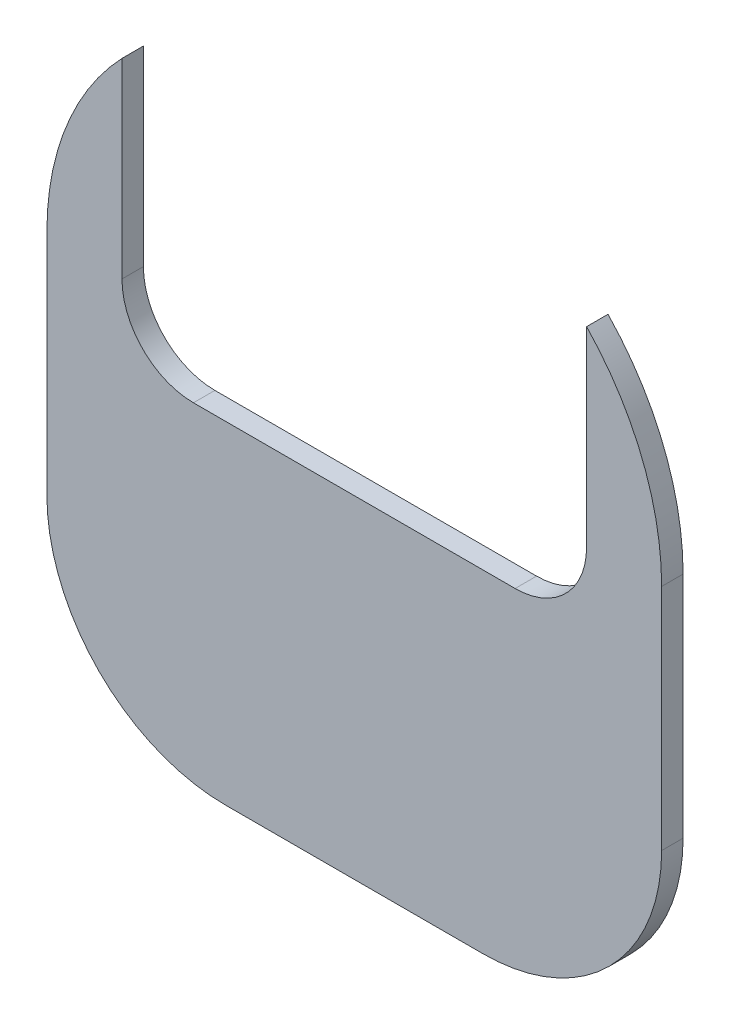
ISO-10303-21;
HEADER;
FILE_DESCRIPTION(('STEP AP214'),'2;1');
FILE_NAME('part.step','',(''),(''),'','','');
FILE_SCHEMA(('AUTOMOTIVE_DESIGN { 1 0 10303 214 1 1 1 1 }'));
ENDSEC;
DATA;
#1=APPLICATION_CONTEXT('core data for automotive mechanical design processes');
#2=APPLICATION_PROTOCOL_DEFINITION('international standard','automotive_design',2000,#1);
#3=PRODUCT_CONTEXT('',#1,'mechanical');
#4=PRODUCT('Part','Part','',(#3));
#5=PRODUCT_RELATED_PRODUCT_CATEGORY('part','',(#4));
#6=PRODUCT_DEFINITION_FORMATION('','',#4);
#7=PRODUCT_DEFINITION_CONTEXT('part definition',#1,'design');
#8=PRODUCT_DEFINITION('design','',#6,#7);
#9=PRODUCT_DEFINITION_SHAPE('','',#8);
#10=(LENGTH_UNIT() NAMED_UNIT(*) SI_UNIT(.MILLI.,.METRE.));
#11=(NAMED_UNIT(*) PLANE_ANGLE_UNIT() SI_UNIT($,.RADIAN.));
#12=(NAMED_UNIT(*) SI_UNIT($,.STERADIAN.) SOLID_ANGLE_UNIT());
#13=UNCERTAINTY_MEASURE_WITH_UNIT(LENGTH_MEASURE(1.E-05),#10,'distance_accuracy_value','');
#14=(GEOMETRIC_REPRESENTATION_CONTEXT(3) GLOBAL_UNCERTAINTY_ASSIGNED_CONTEXT((#13)) GLOBAL_UNIT_ASSIGNED_CONTEXT((#10,
#11,#12)) REPRESENTATION_CONTEXT('',''));
#15=CARTESIAN_POINT('',(0.,0.,0.));
#16=DIRECTION('',(0.,0.,1.));
#17=DIRECTION('',(1.,0.,0.));
#18=AXIS2_PLACEMENT_3D('',#15,#16,#17);
#19=CARTESIAN_POINT('',(-4.99999999999999,-29.5,3.));
#20=DIRECTION('',(0.,0.,-1.));
#21=DIRECTION('',(-1.,0.,0.));
#22=AXIS2_PLACEMENT_3D('',#19,#20,#21);
#23=CYLINDRICAL_SURFACE('',#22,38.);
#24=CARTESIAN_POINT('',(-4.99999999999999,-29.5,3.));
#25=DIRECTION('',(0.,0.,1.));
#26=DIRECTION('',(-1.,0.,0.));
#27=AXIS2_PLACEMENT_3D('',#24,#25,#26);
#28=CIRCLE('',#27,38.);
#29=CARTESIAN_POINT('',(-32.5,-3.27501191611332,3.));
#30=VERTEX_POINT('',#29);
#31=CARTESIAN_POINT('',(-43.,-29.5,3.));
#32=VERTEX_POINT('',#31);
#33=EDGE_CURVE('E95',#30,#32,#28,.T.);
#34=ORIENTED_EDGE('',*,*,#33,.F.);
#35=DIRECTION('',(0.,0.,-1.));
#36=VECTOR('',#35,1.);
#37=CARTESIAN_POINT('',(-32.5,-3.27501191611332,3.));
#38=LINE('',#37,#36);
#39=CARTESIAN_POINT('',(-32.5,-3.27501191611332,0.));
#40=VERTEX_POINT('',#39);
#41=EDGE_CURVE('E211',#30,#40,#38,.T.);
#42=ORIENTED_EDGE('',*,*,#41,.T.);
#43=CARTESIAN_POINT('',(-4.99999999999999,-29.5,0.));
#44=DIRECTION('',(0.,0.,1.));
#45=DIRECTION('',(-1.,0.,0.));
#46=AXIS2_PLACEMENT_3D('',#43,#44,#45);
#47=CIRCLE('',#46,38.);
#48=CARTESIAN_POINT('',(-43.,-29.5,0.));
#49=VERTEX_POINT('',#48);
#50=EDGE_CURVE('E134',#40,#49,#47,.T.);
#51=ORIENTED_EDGE('',*,*,#50,.T.);
#52=DIRECTION('',(0.,0.,-1.));
#53=VECTOR('',#52,1.);
#54=CARTESIAN_POINT('',(-43.,-29.5,3.));
#55=LINE('',#54,#53);
#56=EDGE_CURVE('E155',#32,#49,#55,.T.);
#57=ORIENTED_EDGE('',*,*,#56,.F.);
#58=EDGE_LOOP('',(#34,#42,#51,#57));
#59=FACE_BOUND('',#58,.T.);
#60=ADVANCED_FACE('F37',(#59),#23,.T.);
#61=CARTESIAN_POINT('',(-43.,-29.5,3.));
#62=DIRECTION('',(1.,0.,0.));
#63=DIRECTION('',(0.,0.,-1.));
#64=AXIS2_PLACEMENT_3D('',#61,#62,#63);
#65=PLANE('',#64);
#66=DIRECTION('',(0.,-1.,0.));
#67=VECTOR('',#66,1.);
#68=CARTESIAN_POINT('',(-43.,-29.5,0.));
#69=LINE('',#68,#67);
#70=CARTESIAN_POINT('',(-43.,-61.5,0.));
#71=VERTEX_POINT('',#70);
#72=EDGE_CURVE('E136',#49,#71,#69,.T.);
#73=ORIENTED_EDGE('',*,*,#72,.T.);
#74=DIRECTION('',(0.,0.,-1.));
#75=VECTOR('',#74,1.);
#76=CARTESIAN_POINT('',(-43.,-61.5,3.));
#77=LINE('',#76,#75);
#78=CARTESIAN_POINT('',(-43.,-61.5,3.));
#79=VERTEX_POINT('',#78);
#80=EDGE_CURVE('E152',#79,#71,#77,.T.);
#81=ORIENTED_EDGE('',*,*,#80,.F.);
#82=DIRECTION('',(0.,-1.,0.));
#83=VECTOR('',#82,1.);
#84=CARTESIAN_POINT('',(-43.,-29.5,3.));
#85=LINE('',#84,#83);
#86=EDGE_CURVE('E217',#32,#79,#85,.T.);
#87=ORIENTED_EDGE('',*,*,#86,.F.);
#88=ORIENTED_EDGE('',*,*,#56,.T.);
#89=EDGE_LOOP('',(#73,#81,#87,#88));
#90=FACE_BOUND('',#89,.T.);
#91=ADVANCED_FACE('F221',(#90),#65,.F.);
#92=CARTESIAN_POINT('',(-18.,-61.5,3.));
#93=DIRECTION('',(0.,0.,-1.));
#94=DIRECTION('',(-1.,0.,0.));
#95=AXIS2_PLACEMENT_3D('',#92,#93,#94);
#96=CYLINDRICAL_SURFACE('',#95,25.);
#97=CARTESIAN_POINT('',(-18.,-61.5,0.));
#98=DIRECTION('',(0.,0.,1.));
#99=DIRECTION('',(1.,0.,0.));
#100=AXIS2_PLACEMENT_3D('',#97,#98,#99);
#101=CIRCLE('',#100,25.);
#102=CARTESIAN_POINT('',(-18.,-86.5,0.));
#103=VERTEX_POINT('',#102);
#104=EDGE_CURVE('E139',#71,#103,#101,.T.);
#105=ORIENTED_EDGE('',*,*,#104,.T.);
#106=DIRECTION('',(0.,0.,-1.));
#107=VECTOR('',#106,1.);
#108=CARTESIAN_POINT('',(-18.,-86.5,3.));
#109=LINE('',#108,#107);
#110=CARTESIAN_POINT('',(-18.,-86.5,3.));
#111=VERTEX_POINT('',#110);
#112=EDGE_CURVE('E123',#111,#103,#109,.T.);
#113=ORIENTED_EDGE('',*,*,#112,.F.);
#114=CARTESIAN_POINT('',(-18.,-61.5,3.));
#115=DIRECTION('',(0.,0.,1.));
#116=DIRECTION('',(1.,0.,0.));
#117=AXIS2_PLACEMENT_3D('',#114,#115,#116);
#118=CIRCLE('',#117,25.);
#119=EDGE_CURVE('E112',#79,#111,#118,.T.);
#120=ORIENTED_EDGE('',*,*,#119,.F.);
#121=ORIENTED_EDGE('',*,*,#80,.T.);
#122=EDGE_LOOP('',(#105,#113,#120,#121));
#123=FACE_BOUND('',#122,.T.);
#124=ADVANCED_FACE('F225',(#123),#96,.T.);
#125=CARTESIAN_POINT('',(0.500000000000011,-86.5,3.));
#126=DIRECTION('',(0.,1.,0.));
#127=DIRECTION('',(-1.,0.,0.));
#128=AXIS2_PLACEMENT_3D('',#125,#126,#127);
#129=PLANE('',#128);
#130=DIRECTION('',(1.,0.,0.));
#131=VECTOR('',#130,1.);
#132=CARTESIAN_POINT('',(0.500000000000011,-86.5,0.));
#133=LINE('',#132,#131);
#134=CARTESIAN_POINT('',(18.,-86.5,0.));
#135=VERTEX_POINT('',#134);
#136=EDGE_CURVE('E120',#103,#135,#133,.T.);
#137=ORIENTED_EDGE('',*,*,#136,.T.);
#138=DIRECTION('',(0.,0.,-1.));
#139=VECTOR('',#138,1.);
#140=CARTESIAN_POINT('',(18.,-86.5,3.));
#141=LINE('',#140,#139);
#142=CARTESIAN_POINT('',(18.,-86.5,3.));
#143=VERTEX_POINT('',#142);
#144=EDGE_CURVE('E118',#143,#135,#141,.T.);
#145=ORIENTED_EDGE('',*,*,#144,.F.);
#146=DIRECTION('',(1.,0.,0.));
#147=VECTOR('',#146,1.);
#148=CARTESIAN_POINT('',(-18.,-86.5,3.));
#149=LINE('',#148,#147);
#150=EDGE_CURVE('E105',#111,#143,#149,.T.);
#151=ORIENTED_EDGE('',*,*,#150,.F.);
#152=ORIENTED_EDGE('',*,*,#112,.T.);
#153=EDGE_LOOP('',(#137,#145,#151,#152));
#154=FACE_BOUND('',#153,.T.);
#155=ADVANCED_FACE('F119',(#154),#129,.F.);
#156=CARTESIAN_POINT('',(18.,-61.5,3.));
#157=DIRECTION('',(0.,0.,-1.));
#158=DIRECTION('',(-1.,0.,0.));
#159=AXIS2_PLACEMENT_3D('',#156,#157,#158);
#160=CYLINDRICAL_SURFACE('',#159,25.);
#161=CARTESIAN_POINT('',(18.,-61.5,0.));
#162=DIRECTION('',(0.,0.,1.));
#163=DIRECTION('',(1.,0.,0.));
#164=AXIS2_PLACEMENT_3D('',#161,#162,#163);
#165=CIRCLE('',#164,25.);
#166=CARTESIAN_POINT('',(43.,-61.5,0.));
#167=VERTEX_POINT('',#166);
#168=EDGE_CURVE('E143',#135,#167,#165,.T.);
#169=ORIENTED_EDGE('',*,*,#168,.T.);
#170=DIRECTION('',(0.,0.,-1.));
#171=VECTOR('',#170,1.);
#172=CARTESIAN_POINT('',(43.,-61.5,3.));
#173=LINE('',#172,#171);
#174=CARTESIAN_POINT('',(43.,-61.5,3.));
#175=VERTEX_POINT('',#174);
#176=EDGE_CURVE('E124',#175,#167,#173,.T.);
#177=ORIENTED_EDGE('',*,*,#176,.F.);
#178=CARTESIAN_POINT('',(18.,-61.5,3.));
#179=DIRECTION('',(0.,0.,1.));
#180=DIRECTION('',(1.,0.,0.));
#181=AXIS2_PLACEMENT_3D('',#178,#179,#180);
#182=CIRCLE('',#181,25.);
#183=EDGE_CURVE('E109',#143,#175,#182,.T.);
#184=ORIENTED_EDGE('',*,*,#183,.F.);
#185=ORIENTED_EDGE('',*,*,#144,.T.);
#186=EDGE_LOOP('',(#169,#177,#184,#185));
#187=FACE_BOUND('',#186,.T.);
#188=ADVANCED_FACE('F126',(#187),#160,.T.);
#189=CARTESIAN_POINT('',(43.,-29.5,3.));
#190=DIRECTION('',(-1.,0.,0.));
#191=DIRECTION('',(0.,0.,1.));
#192=AXIS2_PLACEMENT_3D('',#189,#190,#191);
#193=PLANE('',#192);
#194=DIRECTION('',(0.,1.,0.));
#195=VECTOR('',#194,1.);
#196=CARTESIAN_POINT('',(43.,-29.5,0.));
#197=LINE('',#196,#195);
#198=CARTESIAN_POINT('',(43.,-29.5,0.));
#199=VERTEX_POINT('',#198);
#200=EDGE_CURVE('E87',#167,#199,#197,.T.);
#201=ORIENTED_EDGE('',*,*,#200,.T.);
#202=DIRECTION('',(0.,0.,-1.));
#203=VECTOR('',#202,1.);
#204=CARTESIAN_POINT('',(43.,-29.5,3.));
#205=LINE('',#204,#203);
#206=CARTESIAN_POINT('',(43.,-29.5,3.));
#207=VERTEX_POINT('',#206);
#208=EDGE_CURVE('E133',#207,#199,#205,.T.);
#209=ORIENTED_EDGE('',*,*,#208,.F.);
#210=DIRECTION('',(0.,1.,0.));
#211=VECTOR('',#210,1.);
#212=CARTESIAN_POINT('',(43.,-29.5,3.));
#213=LINE('',#212,#211);
#214=EDGE_CURVE('E60',#175,#207,#213,.T.);
#215=ORIENTED_EDGE('',*,*,#214,.F.);
#216=ORIENTED_EDGE('',*,*,#176,.T.);
#217=EDGE_LOOP('',(#201,#209,#215,#216));
#218=FACE_BOUND('',#217,.T.);
#219=ADVANCED_FACE('F227',(#218),#193,.F.);
#220=CARTESIAN_POINT('',(5.,-29.5,3.));
#221=DIRECTION('',(0.,0.,-1.));
#222=DIRECTION('',(-1.,0.,0.));
#223=AXIS2_PLACEMENT_3D('',#220,#221,#222);
#224=CYLINDRICAL_SURFACE('',#223,38.);
#225=CARTESIAN_POINT('',(5.,-29.5,0.));
#226=DIRECTION('',(0.,0.,1.));
#227=DIRECTION('',(-1.,0.,0.));
#228=AXIS2_PLACEMENT_3D('',#225,#226,#227);
#229=CIRCLE('',#228,38.);
#230=CARTESIAN_POINT('',(32.5,-3.27501191611328,0.));
#231=VERTEX_POINT('',#230);
#232=EDGE_CURVE('E146',#199,#231,#229,.T.);
#233=ORIENTED_EDGE('',*,*,#232,.T.);
#234=DIRECTION('',(0.,0.,-1.));
#235=VECTOR('',#234,1.);
#236=CARTESIAN_POINT('',(32.5,-3.27501191611328,3.));
#237=LINE('',#236,#235);
#238=CARTESIAN_POINT('',(32.5,-3.27501191611328,3.));
#239=VERTEX_POINT('',#238);
#240=EDGE_CURVE('E137',#231,#239,#237,.F.);
#241=ORIENTED_EDGE('',*,*,#240,.T.);
#242=CARTESIAN_POINT('',(5.,-29.5,3.));
#243=DIRECTION('',(0.,0.,1.));
#244=DIRECTION('',(-1.,0.,0.));
#245=AXIS2_PLACEMENT_3D('',#242,#243,#244);
#246=CIRCLE('',#245,38.);
#247=EDGE_CURVE('E128',#207,#239,#246,.T.);
#248=ORIENTED_EDGE('',*,*,#247,.F.);
#249=ORIENTED_EDGE('',*,*,#208,.T.);
#250=EDGE_LOOP('',(#233,#241,#248,#249));
#251=FACE_BOUND('',#250,.T.);
#252=ADVANCED_FACE('F230',(#251),#224,.T.);
#253=CARTESIAN_POINT('',(-4.99999999999999,-29.5,3.));
#254=DIRECTION('',(0.,0.,-1.));
#255=DIRECTION('',(-1.,0.,0.));
#256=AXIS2_PLACEMENT_3D('',#253,#254,#255);
#257=PLANE('',#256);
#258=ORIENTED_EDGE('',*,*,#247,.T.);
#259=DIRECTION('',(0.,1.,0.));
#260=VECTOR('',#259,1.);
#261=CARTESIAN_POINT('',(32.5,-30.,3.));
#262=LINE('',#261,#260);
#263=CARTESIAN_POINT('',(32.5,-30.,3.));
#264=VERTEX_POINT('',#263);
#265=EDGE_CURVE('E207',#264,#239,#262,.T.);
#266=ORIENTED_EDGE('',*,*,#265,.F.);
#267=CARTESIAN_POINT('',(22.5,-30.,3.));
#268=DIRECTION('',(0.,0.,1.));
#269=DIRECTION('',(1.,0.,0.));
#270=AXIS2_PLACEMENT_3D('',#267,#268,#269);
#271=CIRCLE('',#270,10.);
#272=CARTESIAN_POINT('',(22.5,-40.,3.));
#273=VERTEX_POINT('',#272);
#274=EDGE_CURVE('E247',#273,#264,#271,.T.);
#275=ORIENTED_EDGE('',*,*,#274,.F.);
#276=DIRECTION('',(1.,0.,0.));
#277=VECTOR('',#276,1.);
#278=CARTESIAN_POINT('',(-22.5,-40.,3.));
#279=LINE('',#278,#277);
#280=CARTESIAN_POINT('',(-22.5,-40.,3.));
#281=VERTEX_POINT('',#280);
#282=EDGE_CURVE('E189',#281,#273,#279,.T.);
#283=ORIENTED_EDGE('',*,*,#282,.F.);
#284=CARTESIAN_POINT('',(-22.5,-30.,3.));
#285=DIRECTION('',(0.,0.,1.));
#286=DIRECTION('',(-1.,0.,0.));
#287=AXIS2_PLACEMENT_3D('',#284,#285,#286);
#288=CIRCLE('',#287,10.);
#289=CARTESIAN_POINT('',(-32.5,-30.,3.));
#290=VERTEX_POINT('',#289);
#291=EDGE_CURVE('E205',#290,#281,#288,.T.);
#292=ORIENTED_EDGE('',*,*,#291,.F.);
#293=DIRECTION('',(0.,-1.,0.));
#294=VECTOR('',#293,1.);
#295=CARTESIAN_POINT('',(-32.5,-30.,3.));
#296=LINE('',#295,#294);
#297=EDGE_CURVE('E253',#30,#290,#296,.T.);
#298=ORIENTED_EDGE('',*,*,#297,.F.);
#299=ORIENTED_EDGE('',*,*,#33,.T.);
#300=ORIENTED_EDGE('',*,*,#86,.T.);
#301=ORIENTED_EDGE('',*,*,#119,.T.);
#302=ORIENTED_EDGE('',*,*,#150,.T.);
#303=ORIENTED_EDGE('',*,*,#183,.T.);
#304=ORIENTED_EDGE('',*,*,#214,.T.);
#305=EDGE_LOOP('',(#258,#266,#275,#283,#292,#298,#299,#300,#301,#302,#303,#304));
#306=FACE_BOUND('',#305,.T.);
#307=ADVANCED_FACE('F107',(#306),#257,.F.);
#308=CARTESIAN_POINT('',(-4.99999999999999,-29.5,0.));
#309=DIRECTION('',(0.,0.,-1.));
#310=DIRECTION('',(-1.,0.,0.));
#311=AXIS2_PLACEMENT_3D('',#308,#309,#310);
#312=PLANE('',#311);
#313=DIRECTION('',(0.,-1.,0.));
#314=VECTOR('',#313,1.);
#315=CARTESIAN_POINT('',(32.5,-29.5,0.));
#316=LINE('',#315,#314);
#317=CARTESIAN_POINT('',(32.5,-30.,0.));
#318=VERTEX_POINT('',#317);
#319=EDGE_CURVE('E11',#231,#318,#316,.T.);
#320=ORIENTED_EDGE('',*,*,#319,.F.);
#321=ORIENTED_EDGE('',*,*,#232,.F.);
#322=ORIENTED_EDGE('',*,*,#200,.F.);
#323=ORIENTED_EDGE('',*,*,#168,.F.);
#324=ORIENTED_EDGE('',*,*,#136,.F.);
#325=ORIENTED_EDGE('',*,*,#104,.F.);
#326=ORIENTED_EDGE('',*,*,#72,.F.);
#327=ORIENTED_EDGE('',*,*,#50,.F.);
#328=DIRECTION('',(0.,1.,0.));
#329=VECTOR('',#328,1.);
#330=CARTESIAN_POINT('',(-32.5,-29.5,0.));
#331=LINE('',#330,#329);
#332=CARTESIAN_POINT('',(-32.5,-30.,0.));
#333=VERTEX_POINT('',#332);
#334=EDGE_CURVE('E158',#333,#40,#331,.T.);
#335=ORIENTED_EDGE('',*,*,#334,.F.);
#336=CARTESIAN_POINT('',(-22.5,-30.,0.));
#337=DIRECTION('',(0.,0.,-1.));
#338=DIRECTION('',(-1.,0.,0.));
#339=AXIS2_PLACEMENT_3D('',#336,#337,#338);
#340=CIRCLE('',#339,10.);
#341=CARTESIAN_POINT('',(-22.5,-40.,0.));
#342=VERTEX_POINT('',#341);
#343=EDGE_CURVE('E160',#342,#333,#340,.T.);
#344=ORIENTED_EDGE('',*,*,#343,.F.);
#345=DIRECTION('',(-1.,0.,0.));
#346=VECTOR('',#345,1.);
#347=CARTESIAN_POINT('',(-4.99999999999999,-40.,0.));
#348=LINE('',#347,#346);
#349=CARTESIAN_POINT('',(22.5,-40.,0.));
#350=VERTEX_POINT('',#349);
#351=EDGE_CURVE('E162',#350,#342,#348,.T.);
#352=ORIENTED_EDGE('',*,*,#351,.F.);
#353=CARTESIAN_POINT('',(22.5,-30.,0.));
#354=DIRECTION('',(0.,0.,-1.));
#355=DIRECTION('',(-1.,0.,0.));
#356=AXIS2_PLACEMENT_3D('',#353,#354,#355);
#357=CIRCLE('',#356,10.);
#358=EDGE_CURVE('E44',#318,#350,#357,.T.);
#359=ORIENTED_EDGE('',*,*,#358,.F.);
#360=EDGE_LOOP('',(#320,#321,#322,#323,#324,#325,#326,#327,#335,#344,#352,#359));
#361=FACE_BOUND('',#360,.T.);
#362=ADVANCED_FACE('F194',(#361),#312,.T.);
#363=CARTESIAN_POINT('',(32.5,-30.,-7.));
#364=DIRECTION('',(1.,0.,0.));
#365=DIRECTION('',(0.,1.,0.));
#366=AXIS2_PLACEMENT_3D('',#363,#364,#365);
#367=PLANE('',#366);
#368=ORIENTED_EDGE('',*,*,#319,.T.);
#369=DIRECTION('',(0.,0.,1.));
#370=VECTOR('',#369,1.);
#371=CARTESIAN_POINT('',(32.5,-30.,-7.));
#372=LINE('',#371,#370);
#373=EDGE_CURVE('E178',#318,#264,#372,.T.);
#374=ORIENTED_EDGE('',*,*,#373,.T.);
#375=ORIENTED_EDGE('',*,*,#265,.T.);
#376=ORIENTED_EDGE('',*,*,#240,.F.);
#377=EDGE_LOOP('',(#368,#374,#375,#376));
#378=FACE_BOUND('',#377,.T.);
#379=ADVANCED_FACE('F246',(#378),#367,.F.);
#380=CARTESIAN_POINT('',(-32.5,-30.,-7.));
#381=DIRECTION('',(-1.,0.,0.));
#382=DIRECTION('',(0.,-1.,0.));
#383=AXIS2_PLACEMENT_3D('',#380,#381,#382);
#384=PLANE('',#383);
#385=ORIENTED_EDGE('',*,*,#297,.T.);
#386=DIRECTION('',(0.,0.,1.));
#387=VECTOR('',#386,1.);
#388=CARTESIAN_POINT('',(-32.5,-30.,-7.));
#389=LINE('',#388,#387);
#390=EDGE_CURVE('E51',#333,#290,#389,.T.);
#391=ORIENTED_EDGE('',*,*,#390,.F.);
#392=ORIENTED_EDGE('',*,*,#334,.T.);
#393=ORIENTED_EDGE('',*,*,#41,.F.);
#394=EDGE_LOOP('',(#385,#391,#392,#393));
#395=FACE_BOUND('',#394,.T.);
#396=ADVANCED_FACE('F254',(#395),#384,.F.);
#397=CARTESIAN_POINT('',(22.5,-30.,-7.));
#398=DIRECTION('',(0.,0.,1.));
#399=DIRECTION('',(1.,0.,0.));
#400=AXIS2_PLACEMENT_3D('',#397,#398,#399);
#401=CYLINDRICAL_SURFACE('',#400,10.);
#402=ORIENTED_EDGE('',*,*,#358,.T.);
#403=DIRECTION('',(0.,0.,1.));
#404=VECTOR('',#403,1.);
#405=CARTESIAN_POINT('',(22.5,-40.,-7.));
#406=LINE('',#405,#404);
#407=EDGE_CURVE('E174',#350,#273,#406,.T.);
#408=ORIENTED_EDGE('',*,*,#407,.T.);
#409=ORIENTED_EDGE('',*,*,#274,.T.);
#410=ORIENTED_EDGE('',*,*,#373,.F.);
#411=EDGE_LOOP('',(#402,#408,#409,#410));
#412=FACE_BOUND('',#411,.T.);
#413=ADVANCED_FACE('F171',(#412),#401,.F.);
#414=CARTESIAN_POINT('',(-22.5,-40.,-7.));
#415=DIRECTION('',(0.,-1.,0.));
#416=DIRECTION('',(1.,0.,0.));
#417=AXIS2_PLACEMENT_3D('',#414,#415,#416);
#418=PLANE('',#417);
#419=ORIENTED_EDGE('',*,*,#351,.T.);
#420=DIRECTION('',(0.,0.,1.));
#421=VECTOR('',#420,1.);
#422=CARTESIAN_POINT('',(-22.5,-40.,-7.));
#423=LINE('',#422,#421);
#424=EDGE_CURVE('E191',#342,#281,#423,.T.);
#425=ORIENTED_EDGE('',*,*,#424,.T.);
#426=ORIENTED_EDGE('',*,*,#282,.T.);
#427=ORIENTED_EDGE('',*,*,#407,.F.);
#428=EDGE_LOOP('',(#419,#425,#426,#427));
#429=FACE_BOUND('',#428,.T.);
#430=ADVANCED_FACE('F185',(#429),#418,.F.);
#431=CARTESIAN_POINT('',(-22.5,-30.,-7.));
#432=DIRECTION('',(0.,0.,1.));
#433=DIRECTION('',(1.,0.,0.));
#434=AXIS2_PLACEMENT_3D('',#431,#432,#433);
#435=CYLINDRICAL_SURFACE('',#434,10.);
#436=ORIENTED_EDGE('',*,*,#343,.T.);
#437=ORIENTED_EDGE('',*,*,#390,.T.);
#438=ORIENTED_EDGE('',*,*,#291,.T.);
#439=ORIENTED_EDGE('',*,*,#424,.F.);
#440=EDGE_LOOP('',(#436,#437,#438,#439));
#441=FACE_BOUND('',#440,.T.);
#442=ADVANCED_FACE('F200',(#441),#435,.F.);
#443=CLOSED_SHELL('',(#60,#91,#124,#155,#188,#219,#252,#307,#362,#379,#396,#413,#430,#442));
#444=MANIFOLD_SOLID_BREP('B2',#443);
#445=ADVANCED_BREP_SHAPE_REPRESENTATION('',(#18,#444),#14);
#446=SHAPE_DEFINITION_REPRESENTATION(#9,#445);
ENDSEC;
END-ISO-10303-21;
